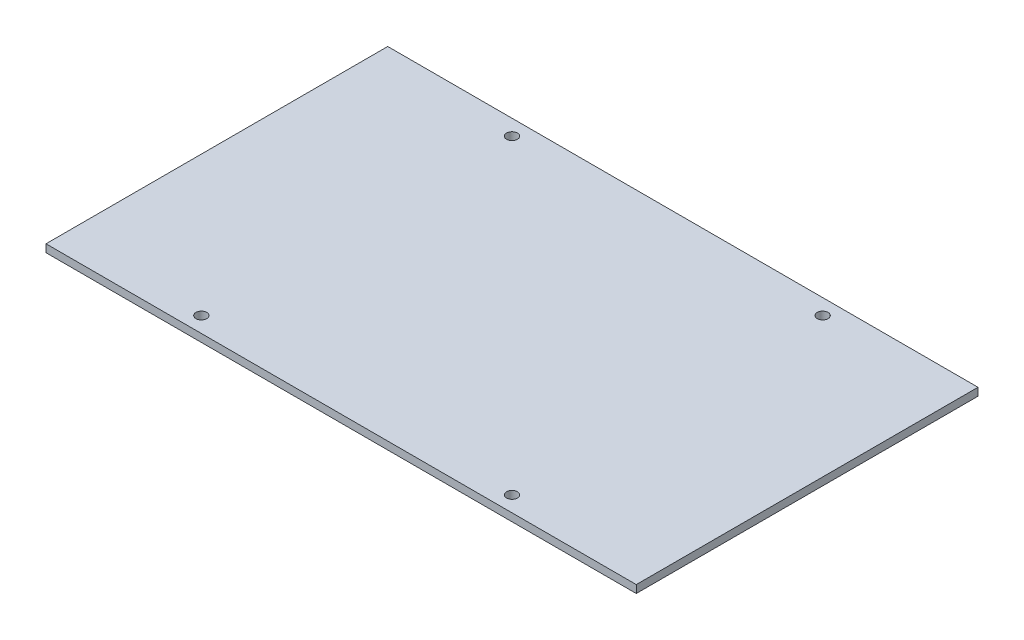
ISO-10303-21;
HEADER;
FILE_DESCRIPTION(('STEP AP214'),'2;1');
FILE_NAME('part.step','',(''),(''),'','','');
FILE_SCHEMA(('AUTOMOTIVE_DESIGN { 1 0 10303 214 1 1 1 1 }'));
ENDSEC;
DATA;
#1=APPLICATION_CONTEXT('core data for automotive mechanical design processes');
#2=APPLICATION_PROTOCOL_DEFINITION('international standard','automotive_design',2000,#1);
#3=PRODUCT_CONTEXT('',#1,'mechanical');
#4=PRODUCT('Part','Part','',(#3));
#5=PRODUCT_RELATED_PRODUCT_CATEGORY('part','',(#4));
#6=PRODUCT_DEFINITION_FORMATION('','',#4);
#7=PRODUCT_DEFINITION_CONTEXT('part definition',#1,'design');
#8=PRODUCT_DEFINITION('design','',#6,#7);
#9=PRODUCT_DEFINITION_SHAPE('','',#8);
#10=(LENGTH_UNIT() NAMED_UNIT(*) SI_UNIT(.MILLI.,.METRE.));
#11=(NAMED_UNIT(*) PLANE_ANGLE_UNIT() SI_UNIT($,.RADIAN.));
#12=(NAMED_UNIT(*) SI_UNIT($,.STERADIAN.) SOLID_ANGLE_UNIT());
#13=UNCERTAINTY_MEASURE_WITH_UNIT(LENGTH_MEASURE(1.E-05),#10,'distance_accuracy_value','');
#14=(GEOMETRIC_REPRESENTATION_CONTEXT(3) GLOBAL_UNCERTAINTY_ASSIGNED_CONTEXT((#13)) GLOBAL_UNIT_ASSIGNED_CONTEXT((#10,
#11,#12)) REPRESENTATION_CONTEXT('',''));
#15=CARTESIAN_POINT('',(0.,0.,0.));
#16=DIRECTION('',(0.,0.,1.));
#17=DIRECTION('',(1.,0.,0.));
#18=AXIS2_PLACEMENT_3D('',#15,#16,#17);
#19=CARTESIAN_POINT('',(190.,2.5,110.));
#20=DIRECTION('',(-1.,0.,0.));
#21=DIRECTION('',(0.,0.,1.));
#22=AXIS2_PLACEMENT_3D('',#19,#20,#21);
#23=PLANE('',#22);
#24=DIRECTION('',(0.,0.,-1.));
#25=VECTOR('',#24,1.);
#26=CARTESIAN_POINT('',(190.,-2.5,110.));
#27=LINE('',#26,#25);
#28=CARTESIAN_POINT('',(190.,-2.5,110.));
#29=VERTEX_POINT('',#28);
#30=CARTESIAN_POINT('',(190.,-2.5,-110.));
#31=VERTEX_POINT('',#30);
#32=EDGE_CURVE('E99',#29,#31,#27,.T.);
#33=ORIENTED_EDGE('',*,*,#32,.T.);
#34=DIRECTION('',(0.,-1.,0.));
#35=VECTOR('',#34,1.);
#36=CARTESIAN_POINT('',(190.,2.5,-110.));
#37=LINE('',#36,#35);
#38=CARTESIAN_POINT('',(190.,2.5,-110.));
#39=VERTEX_POINT('',#38);
#40=EDGE_CURVE('E11',#39,#31,#37,.T.);
#41=ORIENTED_EDGE('',*,*,#40,.F.);
#42=DIRECTION('',(0.,0.,-1.));
#43=VECTOR('',#42,1.);
#44=CARTESIAN_POINT('',(190.,2.5,110.));
#45=LINE('',#44,#43);
#46=CARTESIAN_POINT('',(190.,2.5,110.));
#47=VERTEX_POINT('',#46);
#48=EDGE_CURVE('E87',#47,#39,#45,.T.);
#49=ORIENTED_EDGE('',*,*,#48,.F.);
#50=DIRECTION('',(0.,-1.,0.));
#51=VECTOR('',#50,1.);
#52=CARTESIAN_POINT('',(190.,2.5,110.));
#53=LINE('',#52,#51);
#54=EDGE_CURVE('E95',#47,#29,#53,.T.);
#55=ORIENTED_EDGE('',*,*,#54,.T.);
#56=EDGE_LOOP('',(#33,#41,#49,#55));
#57=FACE_BOUND('',#56,.T.);
#58=ADVANCED_FACE('F36',(#57),#23,.F.);
#59=CARTESIAN_POINT('',(-190.,2.5,-110.));
#60=DIRECTION('',(0.,0.,1.));
#61=DIRECTION('',(1.,0.,0.));
#62=AXIS2_PLACEMENT_3D('',#59,#60,#61);
#63=PLANE('',#62);
#64=DIRECTION('',(-1.,0.,0.));
#65=VECTOR('',#64,1.);
#66=CARTESIAN_POINT('',(-190.,-2.5,-110.));
#67=LINE('',#66,#65);
#68=CARTESIAN_POINT('',(-190.,-2.5,-110.));
#69=VERTEX_POINT('',#68);
#70=EDGE_CURVE('E91',#31,#69,#67,.T.);
#71=ORIENTED_EDGE('',*,*,#70,.T.);
#72=DIRECTION('',(0.,-1.,0.));
#73=VECTOR('',#72,1.);
#74=CARTESIAN_POINT('',(-190.,2.5,-110.));
#75=LINE('',#74,#73);
#76=CARTESIAN_POINT('',(-190.,2.5,-110.));
#77=VERTEX_POINT('',#76);
#78=EDGE_CURVE('E44',#77,#69,#75,.T.);
#79=ORIENTED_EDGE('',*,*,#78,.F.);
#80=DIRECTION('',(-1.,0.,0.));
#81=VECTOR('',#80,1.);
#82=CARTESIAN_POINT('',(-190.,2.5,-110.));
#83=LINE('',#82,#81);
#84=EDGE_CURVE('E82',#39,#77,#83,.T.);
#85=ORIENTED_EDGE('',*,*,#84,.F.);
#86=ORIENTED_EDGE('',*,*,#40,.T.);
#87=EDGE_LOOP('',(#71,#79,#85,#86));
#88=FACE_BOUND('',#87,.T.);
#89=ADVANCED_FACE('F90',(#88),#63,.F.);
#90=CARTESIAN_POINT('',(-190.,2.5,110.));
#91=DIRECTION('',(1.,0.,0.));
#92=DIRECTION('',(0.,0.,-1.));
#93=AXIS2_PLACEMENT_3D('',#90,#91,#92);
#94=PLANE('',#93);
#95=DIRECTION('',(0.,0.,1.));
#96=VECTOR('',#95,1.);
#97=CARTESIAN_POINT('',(-190.,-2.5,110.));
#98=LINE('',#97,#96);
#99=CARTESIAN_POINT('',(-190.,-2.5,110.));
#100=VERTEX_POINT('',#99);
#101=EDGE_CURVE('E69',#69,#100,#98,.T.);
#102=ORIENTED_EDGE('',*,*,#101,.T.);
#103=DIRECTION('',(0.,-1.,0.));
#104=VECTOR('',#103,1.);
#105=CARTESIAN_POINT('',(-190.,2.5,110.));
#106=LINE('',#105,#104);
#107=CARTESIAN_POINT('',(-190.,2.5,110.));
#108=VERTEX_POINT('',#107);
#109=EDGE_CURVE('E92',#108,#100,#106,.T.);
#110=ORIENTED_EDGE('',*,*,#109,.F.);
#111=DIRECTION('',(0.,0.,1.));
#112=VECTOR('',#111,1.);
#113=CARTESIAN_POINT('',(-190.,2.5,110.));
#114=LINE('',#113,#112);
#115=EDGE_CURVE('E85',#77,#108,#114,.T.);
#116=ORIENTED_EDGE('',*,*,#115,.F.);
#117=ORIENTED_EDGE('',*,*,#78,.T.);
#118=EDGE_LOOP('',(#102,#110,#116,#117));
#119=FACE_BOUND('',#118,.T.);
#120=ADVANCED_FACE('F93',(#119),#94,.F.);
#121=CARTESIAN_POINT('',(-190.,2.5,110.));
#122=DIRECTION('',(0.,0.,-1.));
#123=DIRECTION('',(-1.,0.,0.));
#124=AXIS2_PLACEMENT_3D('',#121,#122,#123);
#125=PLANE('',#124);
#126=DIRECTION('',(1.,0.,0.));
#127=VECTOR('',#126,1.);
#128=CARTESIAN_POINT('',(-190.,-2.5,110.));
#129=LINE('',#128,#127);
#130=EDGE_CURVE('E75',#100,#29,#129,.T.);
#131=ORIENTED_EDGE('',*,*,#130,.T.);
#132=ORIENTED_EDGE('',*,*,#54,.F.);
#133=DIRECTION('',(1.,0.,0.));
#134=VECTOR('',#133,1.);
#135=CARTESIAN_POINT('',(-190.,2.5,110.));
#136=LINE('',#135,#134);
#137=EDGE_CURVE('E52',#108,#47,#136,.T.);
#138=ORIENTED_EDGE('',*,*,#137,.F.);
#139=ORIENTED_EDGE('',*,*,#109,.T.);
#140=EDGE_LOOP('',(#131,#132,#138,#139));
#141=FACE_BOUND('',#140,.T.);
#142=ADVANCED_FACE('F107',(#141),#125,.F.);
#143=CARTESIAN_POINT('',(0.,2.5,0.));
#144=DIRECTION('',(0.,-1.,0.));
#145=DIRECTION('',(0.,0.,-1.));
#146=AXIS2_PLACEMENT_3D('',#143,#144,#145);
#147=PLANE('',#146);
#148=CARTESIAN_POINT('',(-100.,2.5,100.));
#149=DIRECTION('',(0.,-1.,0.));
#150=DIRECTION('',(0.,0.,-1.));
#151=AXIS2_PLACEMENT_3D('',#148,#149,#150);
#152=CIRCLE('',#151,3.49999999999999);
#153=CARTESIAN_POINT('',(-100.,2.5,96.5));
#154=VERTEX_POINT('',#153);
#155=EDGE_CURVE('E131',#154,#154,#152,.T.);
#156=ORIENTED_EDGE('',*,*,#155,.T.);
#157=EDGE_LOOP('',(#156));
#158=FACE_BOUND('',#157,.T.);
#159=CARTESIAN_POINT('',(100.,2.5,100.));
#160=DIRECTION('',(0.,1.,0.));
#161=DIRECTION('',(0.,0.,-1.));
#162=AXIS2_PLACEMENT_3D('',#159,#160,#161);
#163=CIRCLE('',#162,3.49999999999999);
#164=CARTESIAN_POINT('',(100.,2.5,96.5));
#165=VERTEX_POINT('',#164);
#166=EDGE_CURVE('E125',#165,#165,#163,.T.);
#167=ORIENTED_EDGE('',*,*,#166,.F.);
#168=EDGE_LOOP('',(#167));
#169=FACE_BOUND('',#168,.T.);
#170=CARTESIAN_POINT('',(100.,2.5,-100.));
#171=DIRECTION('',(0.,-1.,0.));
#172=DIRECTION('',(0.,0.,1.));
#173=AXIS2_PLACEMENT_3D('',#170,#171,#172);
#174=CIRCLE('',#173,3.49999999999999);
#175=CARTESIAN_POINT('',(100.,2.5,-96.5));
#176=VERTEX_POINT('',#175);
#177=EDGE_CURVE('E119',#176,#176,#174,.T.);
#178=ORIENTED_EDGE('',*,*,#177,.T.);
#179=EDGE_LOOP('',(#178));
#180=FACE_BOUND('',#179,.T.);
#181=CARTESIAN_POINT('',(-100.,2.5,-100.));
#182=DIRECTION('',(0.,1.,0.));
#183=DIRECTION('',(0.,0.,1.));
#184=AXIS2_PLACEMENT_3D('',#181,#182,#183);
#185=CIRCLE('',#184,3.49999999999999);
#186=CARTESIAN_POINT('',(-100.,2.5,-96.5));
#187=VERTEX_POINT('',#186);
#188=EDGE_CURVE('E113',#187,#187,#185,.T.);
#189=ORIENTED_EDGE('',*,*,#188,.F.);
#190=EDGE_LOOP('',(#189));
#191=FACE_BOUND('',#190,.T.);
#192=ORIENTED_EDGE('',*,*,#48,.T.);
#193=ORIENTED_EDGE('',*,*,#84,.T.);
#194=ORIENTED_EDGE('',*,*,#115,.T.);
#195=ORIENTED_EDGE('',*,*,#137,.T.);
#196=EDGE_LOOP('',(#192,#193,#194,#195));
#197=FACE_BOUND('',#196,.T.);
#198=ADVANCED_FACE('F83',(#158,#169,#180,#191,#197),#147,.F.);
#199=CARTESIAN_POINT('',(0.,-2.5,0.));
#200=DIRECTION('',(0.,-1.,0.));
#201=DIRECTION('',(0.,0.,-1.));
#202=AXIS2_PLACEMENT_3D('',#199,#200,#201);
#203=PLANE('',#202);
#204=CARTESIAN_POINT('',(-100.,-2.5,100.));
#205=DIRECTION('',(0.,-1.,0.));
#206=DIRECTION('',(0.,0.,-1.));
#207=AXIS2_PLACEMENT_3D('',#204,#205,#206);
#208=CIRCLE('',#207,3.49999999999999);
#209=CARTESIAN_POINT('',(-100.,-2.5,96.5));
#210=VERTEX_POINT('',#209);
#211=EDGE_CURVE('E128',#210,#210,#208,.T.);
#212=ORIENTED_EDGE('',*,*,#211,.F.);
#213=EDGE_LOOP('',(#212));
#214=FACE_BOUND('',#213,.T.);
#215=CARTESIAN_POINT('',(100.,-2.5,100.));
#216=DIRECTION('',(0.,1.,0.));
#217=DIRECTION('',(0.,0.,-1.));
#218=AXIS2_PLACEMENT_3D('',#215,#216,#217);
#219=CIRCLE('',#218,3.49999999999999);
#220=CARTESIAN_POINT('',(100.,-2.5,96.5));
#221=VERTEX_POINT('',#220);
#222=EDGE_CURVE('E122',#221,#221,#219,.T.);
#223=ORIENTED_EDGE('',*,*,#222,.T.);
#224=EDGE_LOOP('',(#223));
#225=FACE_BOUND('',#224,.T.);
#226=CARTESIAN_POINT('',(100.,-2.5,-100.));
#227=DIRECTION('',(0.,-1.,0.));
#228=DIRECTION('',(0.,0.,1.));
#229=AXIS2_PLACEMENT_3D('',#226,#227,#228);
#230=CIRCLE('',#229,3.49999999999999);
#231=CARTESIAN_POINT('',(100.,-2.5,-96.5));
#232=VERTEX_POINT('',#231);
#233=EDGE_CURVE('E116',#232,#232,#230,.T.);
#234=ORIENTED_EDGE('',*,*,#233,.F.);
#235=EDGE_LOOP('',(#234));
#236=FACE_BOUND('',#235,.T.);
#237=CARTESIAN_POINT('',(-100.,-2.5,-100.));
#238=DIRECTION('',(0.,1.,0.));
#239=DIRECTION('',(0.,0.,1.));
#240=AXIS2_PLACEMENT_3D('',#237,#238,#239);
#241=CIRCLE('',#240,3.49999999999999);
#242=CARTESIAN_POINT('',(-100.,-2.5,-96.5));
#243=VERTEX_POINT('',#242);
#244=EDGE_CURVE('E102',#243,#243,#241,.T.);
#245=ORIENTED_EDGE('',*,*,#244,.T.);
#246=EDGE_LOOP('',(#245));
#247=FACE_BOUND('',#246,.T.);
#248=ORIENTED_EDGE('',*,*,#32,.F.);
#249=ORIENTED_EDGE('',*,*,#130,.F.);
#250=ORIENTED_EDGE('',*,*,#101,.F.);
#251=ORIENTED_EDGE('',*,*,#70,.F.);
#252=EDGE_LOOP('',(#248,#249,#250,#251));
#253=FACE_BOUND('',#252,.T.);
#254=ADVANCED_FACE('F110',(#214,#225,#236,#247,#253),#203,.T.);
#255=CARTESIAN_POINT('',(-100.,-2.5,-100.));
#256=DIRECTION('',(0.,1.,0.));
#257=DIRECTION('',(0.,0.,1.));
#258=AXIS2_PLACEMENT_3D('',#255,#256,#257);
#259=CYLINDRICAL_SURFACE('',#258,3.49999999999999);
#260=ORIENTED_EDGE('',*,*,#244,.F.);
#261=EDGE_LOOP('',(#260));
#262=FACE_BOUND('',#261,.T.);
#263=ORIENTED_EDGE('',*,*,#188,.T.);
#264=EDGE_LOOP('',(#263));
#265=FACE_BOUND('',#264,.T.);
#266=ADVANCED_FACE('F142',(#262,#265),#259,.F.);
#267=CARTESIAN_POINT('',(100.,-2.5,-100.));
#268=DIRECTION('',(0.,1.,0.));
#269=DIRECTION('',(0.,0.,1.));
#270=AXIS2_PLACEMENT_3D('',#267,#268,#269);
#271=CYLINDRICAL_SURFACE('',#270,3.49999999999999);
#272=ORIENTED_EDGE('',*,*,#233,.T.);
#273=EDGE_LOOP('',(#272));
#274=FACE_BOUND('',#273,.T.);
#275=ORIENTED_EDGE('',*,*,#177,.F.);
#276=EDGE_LOOP('',(#275));
#277=FACE_BOUND('',#276,.T.);
#278=ADVANCED_FACE('F152',(#274,#277),#271,.F.);
#279=CARTESIAN_POINT('',(100.,-2.5,100.));
#280=DIRECTION('',(0.,1.,0.));
#281=DIRECTION('',(0.,0.,1.));
#282=AXIS2_PLACEMENT_3D('',#279,#280,#281);
#283=CYLINDRICAL_SURFACE('',#282,3.49999999999999);
#284=ORIENTED_EDGE('',*,*,#222,.F.);
#285=EDGE_LOOP('',(#284));
#286=FACE_BOUND('',#285,.T.);
#287=ORIENTED_EDGE('',*,*,#166,.T.);
#288=EDGE_LOOP('',(#287));
#289=FACE_BOUND('',#288,.T.);
#290=ADVANCED_FACE('F194',(#286,#289),#283,.F.);
#291=CARTESIAN_POINT('',(-100.,-2.5,100.));
#292=DIRECTION('',(0.,1.,0.));
#293=DIRECTION('',(0.,0.,1.));
#294=AXIS2_PLACEMENT_3D('',#291,#292,#293);
#295=CYLINDRICAL_SURFACE('',#294,3.49999999999999);
#296=ORIENTED_EDGE('',*,*,#211,.T.);
#297=EDGE_LOOP('',(#296));
#298=FACE_BOUND('',#297,.T.);
#299=ORIENTED_EDGE('',*,*,#155,.F.);
#300=EDGE_LOOP('',(#299));
#301=FACE_BOUND('',#300,.T.);
#302=ADVANCED_FACE('F137',(#298,#301),#295,.F.);
#303=CLOSED_SHELL('',(#58,#89,#120,#142,#198,#254,#266,#278,#290,#302));
#304=MANIFOLD_SOLID_BREP('B2',#303);
#305=ADVANCED_BREP_SHAPE_REPRESENTATION('',(#18,#304),#14);
#306=SHAPE_DEFINITION_REPRESENTATION(#9,#305);
ENDSEC;
END-ISO-10303-21;
